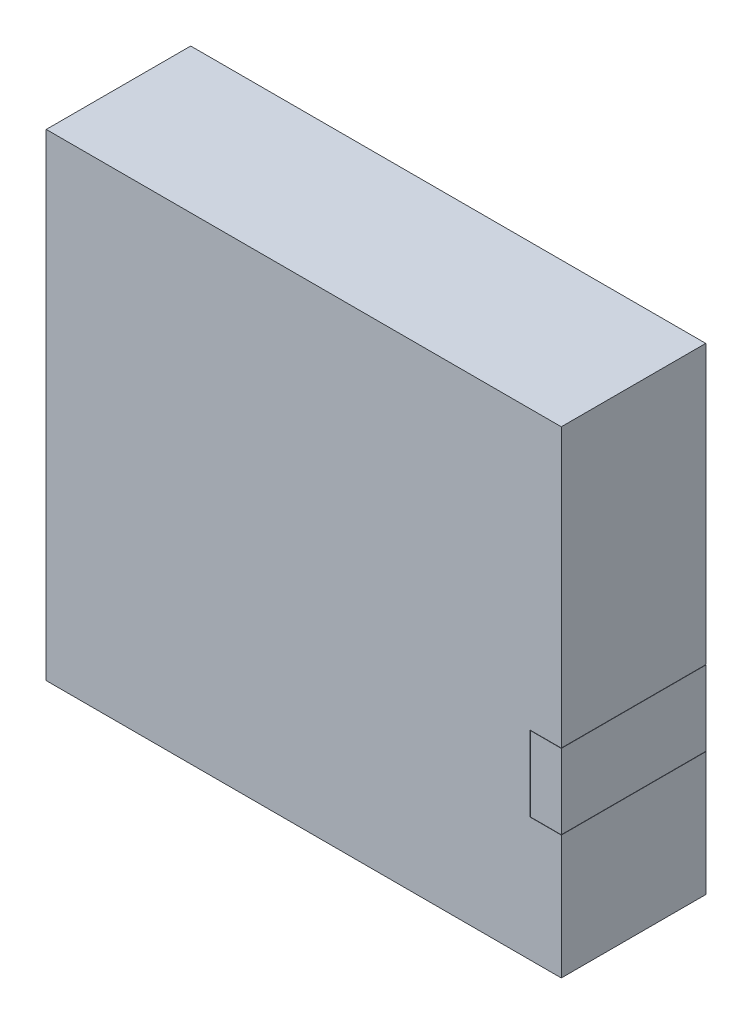
ISO-10303-21;
HEADER;
FILE_DESCRIPTION(('STEP AP214'),'2;1');
FILE_NAME('part.step','',(''),(''),'','','');
FILE_SCHEMA(('AUTOMOTIVE_DESIGN { 1 0 10303 214 1 1 1 1 }'));
ENDSEC;
DATA;
#1=APPLICATION_CONTEXT('core data for automotive mechanical design processes');
#2=APPLICATION_PROTOCOL_DEFINITION('international standard','automotive_design',2000,#1);
#3=PRODUCT_CONTEXT('',#1,'mechanical');
#4=PRODUCT('Part','Part','',(#3));
#5=PRODUCT_RELATED_PRODUCT_CATEGORY('part','',(#4));
#6=PRODUCT_DEFINITION_FORMATION('','',#4);
#7=PRODUCT_DEFINITION_CONTEXT('part definition',#1,'design');
#8=PRODUCT_DEFINITION('design','',#6,#7);
#9=PRODUCT_DEFINITION_SHAPE('','',#8);
#10=(LENGTH_UNIT() NAMED_UNIT(*) SI_UNIT(.MILLI.,.METRE.));
#11=(NAMED_UNIT(*) PLANE_ANGLE_UNIT() SI_UNIT($,.RADIAN.));
#12=(NAMED_UNIT(*) SI_UNIT($,.STERADIAN.) SOLID_ANGLE_UNIT());
#13=UNCERTAINTY_MEASURE_WITH_UNIT(LENGTH_MEASURE(1.E-05),#10,'distance_accuracy_value','');
#14=(GEOMETRIC_REPRESENTATION_CONTEXT(3) GLOBAL_UNCERTAINTY_ASSIGNED_CONTEXT((#13)) GLOBAL_UNIT_ASSIGNED_CONTEXT((#10,
#11,#12)) REPRESENTATION_CONTEXT('',''));
#15=CARTESIAN_POINT('',(0.,0.,0.));
#16=DIRECTION('',(0.,0.,1.));
#17=DIRECTION('',(1.,0.,0.));
#18=AXIS2_PLACEMENT_3D('',#15,#16,#17);
#19=CARTESIAN_POINT('',(35.5484304932736,-22.1016935657433,0.));
#20=DIRECTION('',(-1.,0.,0.));
#21=DIRECTION('',(0.,-1.,0.));
#22=AXIS2_PLACEMENT_3D('',#19,#20,#21);
#23=PLANE('',#22);
#24=DIRECTION('',(0.,-1.,0.));
#25=VECTOR('',#24,1.);
#26=CARTESIAN_POINT('',(35.5484304932736,-22.1016935657433,23.));
#27=LINE('',#26,#25);
#28=CARTESIAN_POINT('',(35.5484304932736,-22.1016935657433,23.));
#29=VERTEX_POINT('',#28);
#30=CARTESIAN_POINT('',(35.5484304932736,-34.0016935657433,23.));
#31=VERTEX_POINT('',#30);
#32=EDGE_CURVE('E113',#29,#31,#27,.T.);
#33=ORIENTED_EDGE('',*,*,#32,.F.);
#34=DIRECTION('',(0.,0.,1.));
#35=VECTOR('',#34,1.);
#36=CARTESIAN_POINT('',(35.5484304932736,-22.1016935657433,0.));
#37=LINE('',#36,#35);
#38=CARTESIAN_POINT('',(35.5484304932736,-22.1016935657433,0.));
#39=VERTEX_POINT('',#38);
#40=EDGE_CURVE('E12',#39,#29,#37,.T.);
#41=ORIENTED_EDGE('',*,*,#40,.F.);
#42=DIRECTION('',(0.,-1.,0.));
#43=VECTOR('',#42,1.);
#44=CARTESIAN_POINT('',(35.5484304932736,-22.1016935657433,0.));
#45=LINE('',#44,#43);
#46=CARTESIAN_POINT('',(35.5484304932736,-34.0016935657433,0.));
#47=VERTEX_POINT('',#46);
#48=EDGE_CURVE('E107',#39,#47,#45,.T.);
#49=ORIENTED_EDGE('',*,*,#48,.T.);
#50=DIRECTION('',(0.,0.,1.));
#51=VECTOR('',#50,1.);
#52=CARTESIAN_POINT('',(35.5484304932736,-34.0016935657433,0.));
#53=LINE('',#52,#51);
#54=EDGE_CURVE('E52',#47,#31,#53,.T.);
#55=ORIENTED_EDGE('',*,*,#54,.T.);
#56=EDGE_LOOP('',(#33,#41,#49,#55));
#57=FACE_BOUND('',#56,.T.);
#58=ADVANCED_FACE('F49',(#57),#23,.T.);
#59=CARTESIAN_POINT('',(35.5484304932736,-22.1016935657433,0.));
#60=DIRECTION('',(0.,1.,0.));
#61=DIRECTION('',(0.,0.,1.));
#62=AXIS2_PLACEMENT_3D('',#59,#60,#61);
#63=PLANE('',#62);
#64=DIRECTION('',(-1.,0.,0.));
#65=VECTOR('',#64,1.);
#66=CARTESIAN_POINT('',(35.5484304932736,-22.1016935657433,23.));
#67=LINE('',#66,#65);
#68=CARTESIAN_POINT('',(40.4484304932736,-22.1016935657433,23.));
#69=VERTEX_POINT('',#68);
#70=EDGE_CURVE('E109',#69,#29,#67,.T.);
#71=ORIENTED_EDGE('',*,*,#70,.F.);
#72=DIRECTION('',(0.,0.,1.));
#73=VECTOR('',#72,1.);
#74=CARTESIAN_POINT('',(40.4484304932736,-22.1016935657433,0.));
#75=LINE('',#74,#73);
#76=CARTESIAN_POINT('',(40.4484304932736,-22.1016935657433,0.));
#77=VERTEX_POINT('',#76);
#78=EDGE_CURVE('E58',#77,#69,#75,.T.);
#79=ORIENTED_EDGE('',*,*,#78,.F.);
#80=DIRECTION('',(-1.,0.,0.));
#81=VECTOR('',#80,1.);
#82=CARTESIAN_POINT('',(35.5484304932736,-22.1016935657433,0.));
#83=LINE('',#82,#81);
#84=EDGE_CURVE('E104',#77,#39,#83,.T.);
#85=ORIENTED_EDGE('',*,*,#84,.T.);
#86=ORIENTED_EDGE('',*,*,#40,.T.);
#87=EDGE_LOOP('',(#71,#79,#85,#86));
#88=FACE_BOUND('',#87,.T.);
#89=ADVANCED_FACE('F123',(#88),#63,.T.);
#90=CARTESIAN_POINT('',(40.4484304932736,-22.1016935657433,0.));
#91=DIRECTION('',(1.,0.,0.));
#92=DIRECTION('',(0.,0.,-1.));
#93=AXIS2_PLACEMENT_3D('',#90,#91,#92);
#94=PLANE('',#93);
#95=DIRECTION('',(0.,1.,0.));
#96=VECTOR('',#95,1.);
#97=CARTESIAN_POINT('',(40.4484304932736,-22.1016935657433,23.));
#98=LINE('',#97,#96);
#99=CARTESIAN_POINT('',(40.4484304932736,-34.0016935657433,23.));
#100=VERTEX_POINT('',#99);
#101=EDGE_CURVE('E99',#100,#69,#98,.T.);
#102=ORIENTED_EDGE('',*,*,#101,.F.);
#103=DIRECTION('',(0.,0.,1.));
#104=VECTOR('',#103,1.);
#105=CARTESIAN_POINT('',(40.4484304932736,-34.0016935657433,0.));
#106=LINE('',#105,#104);
#107=CARTESIAN_POINT('',(40.4484304932736,-34.0016935657433,0.));
#108=VERTEX_POINT('',#107);
#109=EDGE_CURVE('E94',#108,#100,#106,.T.);
#110=ORIENTED_EDGE('',*,*,#109,.F.);
#111=DIRECTION('',(0.,1.,0.));
#112=VECTOR('',#111,1.);
#113=CARTESIAN_POINT('',(40.4484304932736,-22.1016935657433,0.));
#114=LINE('',#113,#112);
#115=EDGE_CURVE('E97',#108,#77,#114,.T.);
#116=ORIENTED_EDGE('',*,*,#115,.T.);
#117=ORIENTED_EDGE('',*,*,#78,.T.);
#118=EDGE_LOOP('',(#102,#110,#116,#117));
#119=FACE_BOUND('',#118,.T.);
#120=ADVANCED_FACE('F96',(#119),#94,.T.);
#121=CARTESIAN_POINT('',(35.5484304932736,-34.0016935657433,0.));
#122=DIRECTION('',(0.,-1.,0.));
#123=DIRECTION('',(0.,0.,-1.));
#124=AXIS2_PLACEMENT_3D('',#121,#122,#123);
#125=PLANE('',#124);
#126=DIRECTION('',(1.,0.,0.));
#127=VECTOR('',#126,1.);
#128=CARTESIAN_POINT('',(35.5484304932736,-34.0016935657433,23.));
#129=LINE('',#128,#127);
#130=EDGE_CURVE('E116',#31,#100,#129,.T.);
#131=ORIENTED_EDGE('',*,*,#130,.F.);
#132=ORIENTED_EDGE('',*,*,#54,.F.);
#133=DIRECTION('',(1.,0.,0.));
#134=VECTOR('',#133,1.);
#135=CARTESIAN_POINT('',(35.5484304932736,-34.0016935657433,0.));
#136=LINE('',#135,#134);
#137=EDGE_CURVE('E103',#47,#108,#136,.T.);
#138=ORIENTED_EDGE('',*,*,#137,.T.);
#139=ORIENTED_EDGE('',*,*,#109,.T.);
#140=EDGE_LOOP('',(#131,#132,#138,#139));
#141=FACE_BOUND('',#140,.T.);
#142=ADVANCED_FACE('F106',(#141),#125,.T.);
#143=CARTESIAN_POINT('',(0.,0.,0.));
#144=DIRECTION('',(0.,0.,1.));
#145=DIRECTION('',(1.,0.,0.));
#146=AXIS2_PLACEMENT_3D('',#143,#144,#145);
#147=PLANE('',#146);
#148=ORIENTED_EDGE('',*,*,#48,.F.);
#149=ORIENTED_EDGE('',*,*,#84,.F.);
#150=ORIENTED_EDGE('',*,*,#115,.F.);
#151=ORIENTED_EDGE('',*,*,#137,.F.);
#152=EDGE_LOOP('',(#148,#149,#150,#151));
#153=FACE_BOUND('',#152,.T.);
#154=ADVANCED_FACE('F102',(#153),#147,.F.);
#155=CARTESIAN_POINT('',(0.,0.,23.));
#156=DIRECTION('',(0.,0.,1.));
#157=DIRECTION('',(1.,0.,0.));
#158=AXIS2_PLACEMENT_3D('',#155,#156,#157);
#159=PLANE('',#158);
#160=ORIENTED_EDGE('',*,*,#32,.T.);
#161=ORIENTED_EDGE('',*,*,#130,.T.);
#162=ORIENTED_EDGE('',*,*,#101,.T.);
#163=ORIENTED_EDGE('',*,*,#70,.T.);
#164=EDGE_LOOP('',(#160,#161,#162,#163));
#165=FACE_BOUND('',#164,.T.);
#166=ADVANCED_FACE('F122',(#165),#159,.T.);
#167=CLOSED_SHELL('',(#58,#89,#120,#142,#154,#166));
#168=MANIFOLD_SOLID_BREP('B2',#167);
#169=CARTESIAN_POINT('',(40.4484304932736,22.2466367713004,23.));
#170=DIRECTION('',(-1.,0.,0.));
#171=DIRECTION('',(0.,-1.,0.));
#172=AXIS2_PLACEMENT_3D('',#169,#170,#171);
#173=PLANE('',#172);
#174=DIRECTION('',(0.,1.,0.));
#175=VECTOR('',#174,1.);
#176=CARTESIAN_POINT('',(40.4484304932736,22.2466367713004,0.));
#177=LINE('',#176,#175);
#178=CARTESIAN_POINT('',(40.4484304932736,-53.7533632286996,0.));
#179=VERTEX_POINT('',#178);
#180=CARTESIAN_POINT('',(40.4484304932736,-34.0516935657433,0.));
#181=VERTEX_POINT('',#180);
#182=EDGE_CURVE('E271',#179,#181,#177,.T.);
#183=ORIENTED_EDGE('',*,*,#182,.T.);
#184=DIRECTION('',(0.,0.,1.));
#185=VECTOR('',#184,1.);
#186=CARTESIAN_POINT('',(40.4484304932736,-34.0516935657433,0.));
#187=LINE('',#186,#185);
#188=CARTESIAN_POINT('',(40.4484304932736,-34.0516935657433,23.));
#189=VERTEX_POINT('',#188);
#190=EDGE_CURVE('E314',#181,#189,#187,.T.);
#191=ORIENTED_EDGE('',*,*,#190,.T.);
#192=DIRECTION('',(0.,1.,0.));
#193=VECTOR('',#192,1.);
#194=CARTESIAN_POINT('',(40.4484304932736,22.2466367713004,23.));
#195=LINE('',#194,#193);
#196=CARTESIAN_POINT('',(40.4484304932736,-53.7533632286996,23.));
#197=VERTEX_POINT('',#196);
#198=EDGE_CURVE('E296',#197,#189,#195,.T.);
#199=ORIENTED_EDGE('',*,*,#198,.F.);
#200=DIRECTION('',(0.,0.,-1.));
#201=VECTOR('',#200,1.);
#202=CARTESIAN_POINT('',(40.4484304932736,-53.7533632286996,23.));
#203=LINE('',#202,#201);
#204=EDGE_CURVE('E182',#197,#179,#203,.T.);
#205=ORIENTED_EDGE('',*,*,#204,.T.);
#206=EDGE_LOOP('',(#183,#191,#199,#205));
#207=FACE_BOUND('',#206,.T.);
#208=ADVANCED_FACE('F173',(#207),#173,.F.);
#209=CARTESIAN_POINT('',(-41.5515695067264,22.2466367713004,23.));
#210=DIRECTION('',(1.,0.,0.));
#211=DIRECTION('',(0.,0.,-1.));
#212=AXIS2_PLACEMENT_3D('',#209,#210,#211);
#213=PLANE('',#212);
#214=DIRECTION('',(0.,-1.,0.));
#215=VECTOR('',#214,1.);
#216=CARTESIAN_POINT('',(-41.5515695067264,22.2466367713004,0.));
#217=LINE('',#216,#215);
#218=CARTESIAN_POINT('',(-41.5515695067264,22.2466367713004,0.));
#219=VERTEX_POINT('',#218);
#220=CARTESIAN_POINT('',(-41.5515695067264,-53.7533632286996,0.));
#221=VERTEX_POINT('',#220);
#222=EDGE_CURVE('E277',#219,#221,#217,.T.);
#223=ORIENTED_EDGE('',*,*,#222,.T.);
#224=DIRECTION('',(0.,0.,-1.));
#225=VECTOR('',#224,1.);
#226=CARTESIAN_POINT('',(-41.5515695067264,-53.7533632286996,23.));
#227=LINE('',#226,#225);
#228=CARTESIAN_POINT('',(-41.5515695067264,-53.7533632286996,23.));
#229=VERTEX_POINT('',#228);
#230=EDGE_CURVE('E47',#229,#221,#227,.T.);
#231=ORIENTED_EDGE('',*,*,#230,.F.);
#232=DIRECTION('',(0.,-1.,0.));
#233=VECTOR('',#232,1.);
#234=CARTESIAN_POINT('',(-41.5515695067264,22.2466367713004,23.));
#235=LINE('',#234,#233);
#236=CARTESIAN_POINT('',(-41.5515695067264,22.2466367713004,23.));
#237=VERTEX_POINT('',#236);
#238=EDGE_CURVE('E283',#237,#229,#235,.T.);
#239=ORIENTED_EDGE('',*,*,#238,.F.);
#240=DIRECTION('',(0.,0.,-1.));
#241=VECTOR('',#240,1.);
#242=CARTESIAN_POINT('',(-41.5515695067264,22.2466367713004,23.));
#243=LINE('',#242,#241);
#244=EDGE_CURVE('E284',#237,#219,#243,.T.);
#245=ORIENTED_EDGE('',*,*,#244,.T.);
#246=EDGE_LOOP('',(#223,#231,#239,#245));
#247=FACE_BOUND('',#246,.T.);
#248=ADVANCED_FACE('F175',(#247),#213,.F.);
#249=CARTESIAN_POINT('',(-41.5515695067264,-53.7533632286996,23.));
#250=DIRECTION('',(0.,1.,0.));
#251=DIRECTION('',(0.,0.,1.));
#252=AXIS2_PLACEMENT_3D('',#249,#250,#251);
#253=PLANE('',#252);
#254=DIRECTION('',(1.,0.,0.));
#255=VECTOR('',#254,1.);
#256=CARTESIAN_POINT('',(-41.5515695067264,-53.7533632286996,0.));
#257=LINE('',#256,#255);
#258=EDGE_CURVE('E272',#221,#179,#257,.T.);
#259=ORIENTED_EDGE('',*,*,#258,.T.);
#260=ORIENTED_EDGE('',*,*,#204,.F.);
#261=DIRECTION('',(1.,0.,0.));
#262=VECTOR('',#261,1.);
#263=CARTESIAN_POINT('',(-41.5515695067264,-53.7533632286996,23.));
#264=LINE('',#263,#262);
#265=EDGE_CURVE('E226',#229,#197,#264,.T.);
#266=ORIENTED_EDGE('',*,*,#265,.F.);
#267=ORIENTED_EDGE('',*,*,#230,.T.);
#268=EDGE_LOOP('',(#259,#260,#266,#267));
#269=FACE_BOUND('',#268,.T.);
#270=ADVANCED_FACE('F343',(#269),#253,.F.);
#271=CARTESIAN_POINT('',(40.4484304932736,-22.0516935657433,23.));
#272=VERTEX_POINT('',#271);
#273=CARTESIAN_POINT('',(40.4484304932736,22.2466367713004,23.));
#274=VERTEX_POINT('',#273);
#275=EDGE_CURVE('E264',#272,#274,#195,.T.);
#276=ORIENTED_EDGE('',*,*,#275,.F.);
#277=DIRECTION('',(0.,0.,1.));
#278=VECTOR('',#277,1.);
#279=CARTESIAN_POINT('',(40.4484304932736,-22.0516935657433,0.));
#280=LINE('',#279,#278);
#281=CARTESIAN_POINT('',(40.4484304932736,-22.0516935657433,0.));
#282=VERTEX_POINT('',#281);
#283=EDGE_CURVE('E251',#282,#272,#280,.T.);
#284=ORIENTED_EDGE('',*,*,#283,.F.);
#285=CARTESIAN_POINT('',(40.4484304932736,22.2466367713004,0.));
#286=VERTEX_POINT('',#285);
#287=EDGE_CURVE('E263',#282,#286,#177,.T.);
#288=ORIENTED_EDGE('',*,*,#287,.T.);
#289=DIRECTION('',(0.,0.,-1.));
#290=VECTOR('',#289,1.);
#291=CARTESIAN_POINT('',(40.4484304932736,22.2466367713004,23.));
#292=LINE('',#291,#290);
#293=EDGE_CURVE('E287',#274,#286,#292,.T.);
#294=ORIENTED_EDGE('',*,*,#293,.F.);
#295=EDGE_LOOP('',(#276,#284,#288,#294));
#296=FACE_BOUND('',#295,.T.);
#297=ADVANCED_FACE('F261',(#296),#173,.F.);
#298=CARTESIAN_POINT('',(-41.5515695067264,22.2466367713004,23.));
#299=DIRECTION('',(0.,-1.,0.));
#300=DIRECTION('',(0.,0.,-1.));
#301=AXIS2_PLACEMENT_3D('',#298,#299,#300);
#302=PLANE('',#301);
#303=DIRECTION('',(-1.,0.,0.));
#304=VECTOR('',#303,1.);
#305=CARTESIAN_POINT('',(-41.5515695067264,22.2466367713004,0.));
#306=LINE('',#305,#304);
#307=EDGE_CURVE('E219',#286,#219,#306,.T.);
#308=ORIENTED_EDGE('',*,*,#307,.T.);
#309=ORIENTED_EDGE('',*,*,#244,.F.);
#310=DIRECTION('',(-1.,0.,0.));
#311=VECTOR('',#310,1.);
#312=CARTESIAN_POINT('',(-41.5515695067264,22.2466367713004,23.));
#313=LINE('',#312,#311);
#314=EDGE_CURVE('E198',#274,#237,#313,.T.);
#315=ORIENTED_EDGE('',*,*,#314,.F.);
#316=ORIENTED_EDGE('',*,*,#293,.T.);
#317=EDGE_LOOP('',(#308,#309,#315,#316));
#318=FACE_BOUND('',#317,.T.);
#319=ADVANCED_FACE('F334',(#318),#302,.F.);
#320=CARTESIAN_POINT('',(0.,0.,23.));
#321=DIRECTION('',(0.,0.,1.));
#322=DIRECTION('',(1.,0.,0.));
#323=AXIS2_PLACEMENT_3D('',#320,#321,#322);
#324=PLANE('',#323);
#325=DIRECTION('',(1.,0.,0.));
#326=VECTOR('',#325,1.);
#327=CARTESIAN_POINT('',(40.4484304932736,-34.0516935657433,23.));
#328=LINE('',#327,#326);
#329=CARTESIAN_POINT('',(35.4484304932736,-34.0516935657433,23.));
#330=VERTEX_POINT('',#329);
#331=EDGE_CURVE('E257',#330,#189,#328,.T.);
#332=ORIENTED_EDGE('',*,*,#331,.F.);
#333=DIRECTION('',(0.,-1.,0.));
#334=VECTOR('',#333,1.);
#335=CARTESIAN_POINT('',(35.4484304932736,-34.0516935657433,23.));
#336=LINE('',#335,#334);
#337=CARTESIAN_POINT('',(35.4484304932736,-22.0516935657433,23.));
#338=VERTEX_POINT('',#337);
#339=EDGE_CURVE('E308',#338,#330,#336,.T.);
#340=ORIENTED_EDGE('',*,*,#339,.F.);
#341=DIRECTION('',(-1.,0.,0.));
#342=VECTOR('',#341,1.);
#343=CARTESIAN_POINT('',(40.4484304932736,-22.0516935657433,23.));
#344=LINE('',#343,#342);
#345=EDGE_CURVE('E305',#272,#338,#344,.T.);
#346=ORIENTED_EDGE('',*,*,#345,.F.);
#347=ORIENTED_EDGE('',*,*,#275,.T.);
#348=ORIENTED_EDGE('',*,*,#314,.T.);
#349=ORIENTED_EDGE('',*,*,#238,.T.);
#350=ORIENTED_EDGE('',*,*,#265,.T.);
#351=ORIENTED_EDGE('',*,*,#198,.T.);
#352=EDGE_LOOP('',(#332,#340,#346,#347,#348,#349,#350,#351));
#353=FACE_BOUND('',#352,.T.);
#354=ADVANCED_FACE('F336',(#353),#324,.T.);
#355=CARTESIAN_POINT('',(0.,0.,0.));
#356=DIRECTION('',(0.,0.,1.));
#357=DIRECTION('',(1.,0.,0.));
#358=AXIS2_PLACEMENT_3D('',#355,#356,#357);
#359=PLANE('',#358);
#360=DIRECTION('',(0.,-1.,0.));
#361=VECTOR('',#360,1.);
#362=CARTESIAN_POINT('',(35.4484304932736,-34.0516935657433,0.));
#363=LINE('',#362,#361);
#364=CARTESIAN_POINT('',(35.4484304932736,-22.0516935657433,0.));
#365=VERTEX_POINT('',#364);
#366=CARTESIAN_POINT('',(35.4484304932736,-34.0516935657433,0.));
#367=VERTEX_POINT('',#366);
#368=EDGE_CURVE('E189',#365,#367,#363,.T.);
#369=ORIENTED_EDGE('',*,*,#368,.T.);
#370=DIRECTION('',(1.,0.,0.));
#371=VECTOR('',#370,1.);
#372=CARTESIAN_POINT('',(40.4484304932736,-34.0516935657433,0.));
#373=LINE('',#372,#371);
#374=EDGE_CURVE('E266',#367,#181,#373,.T.);
#375=ORIENTED_EDGE('',*,*,#374,.T.);
#376=ORIENTED_EDGE('',*,*,#182,.F.);
#377=ORIENTED_EDGE('',*,*,#258,.F.);
#378=ORIENTED_EDGE('',*,*,#222,.F.);
#379=ORIENTED_EDGE('',*,*,#307,.F.);
#380=ORIENTED_EDGE('',*,*,#287,.F.);
#381=DIRECTION('',(-1.,0.,0.));
#382=VECTOR('',#381,1.);
#383=CARTESIAN_POINT('',(40.4484304932736,-22.0516935657433,0.));
#384=LINE('',#383,#382);
#385=EDGE_CURVE('E247',#282,#365,#384,.T.);
#386=ORIENTED_EDGE('',*,*,#385,.T.);
#387=EDGE_LOOP('',(#369,#375,#376,#377,#378,#379,#380,#386));
#388=FACE_BOUND('',#387,.T.);
#389=ADVANCED_FACE('F268',(#388),#359,.F.);
#390=CARTESIAN_POINT('',(40.4484304932736,-34.0516935657433,0.));
#391=DIRECTION('',(0.,-1.,0.));
#392=DIRECTION('',(0.,0.,-1.));
#393=AXIS2_PLACEMENT_3D('',#390,#391,#392);
#394=PLANE('',#393);
#395=ORIENTED_EDGE('',*,*,#331,.T.);
#396=ORIENTED_EDGE('',*,*,#190,.F.);
#397=ORIENTED_EDGE('',*,*,#374,.F.);
#398=DIRECTION('',(0.,0.,1.));
#399=VECTOR('',#398,1.);
#400=CARTESIAN_POINT('',(35.4484304932736,-34.0516935657433,0.));
#401=LINE('',#400,#399);
#402=EDGE_CURVE('E317',#367,#330,#401,.T.);
#403=ORIENTED_EDGE('',*,*,#402,.T.);
#404=EDGE_LOOP('',(#395,#396,#397,#403));
#405=FACE_BOUND('',#404,.T.);
#406=ADVANCED_FACE('F377',(#405),#394,.F.);
#407=CARTESIAN_POINT('',(35.4484304932736,-34.0516935657433,0.));
#408=DIRECTION('',(-1.,0.,0.));
#409=DIRECTION('',(0.,0.,1.));
#410=AXIS2_PLACEMENT_3D('',#407,#408,#409);
#411=PLANE('',#410);
#412=ORIENTED_EDGE('',*,*,#339,.T.);
#413=ORIENTED_EDGE('',*,*,#402,.F.);
#414=ORIENTED_EDGE('',*,*,#368,.F.);
#415=DIRECTION('',(0.,0.,1.));
#416=VECTOR('',#415,1.);
#417=CARTESIAN_POINT('',(35.4484304932736,-22.0516935657433,0.));
#418=LINE('',#417,#416);
#419=EDGE_CURVE('E253',#365,#338,#418,.T.);
#420=ORIENTED_EDGE('',*,*,#419,.T.);
#421=EDGE_LOOP('',(#412,#413,#414,#420));
#422=FACE_BOUND('',#421,.T.);
#423=ADVANCED_FACE('F385',(#422),#411,.F.);
#424=CARTESIAN_POINT('',(40.4484304932736,-22.0516935657433,0.));
#425=DIRECTION('',(0.,1.,0.));
#426=DIRECTION('',(0.,0.,1.));
#427=AXIS2_PLACEMENT_3D('',#424,#425,#426);
#428=PLANE('',#427);
#429=ORIENTED_EDGE('',*,*,#345,.T.);
#430=ORIENTED_EDGE('',*,*,#419,.F.);
#431=ORIENTED_EDGE('',*,*,#385,.F.);
#432=ORIENTED_EDGE('',*,*,#283,.T.);
#433=EDGE_LOOP('',(#429,#430,#431,#432));
#434=FACE_BOUND('',#433,.T.);
#435=ADVANCED_FACE('F250',(#434),#428,.F.);
#436=CLOSED_SHELL('',(#208,#248,#270,#297,#319,#354,#389,#406,#423,#435));
#437=MANIFOLD_SOLID_BREP('B6',#436);
#438=ADVANCED_BREP_SHAPE_REPRESENTATION('',(#18,#168,#437),#14);
#439=SHAPE_DEFINITION_REPRESENTATION(#9,#438);
ENDSEC;
END-ISO-10303-21;
